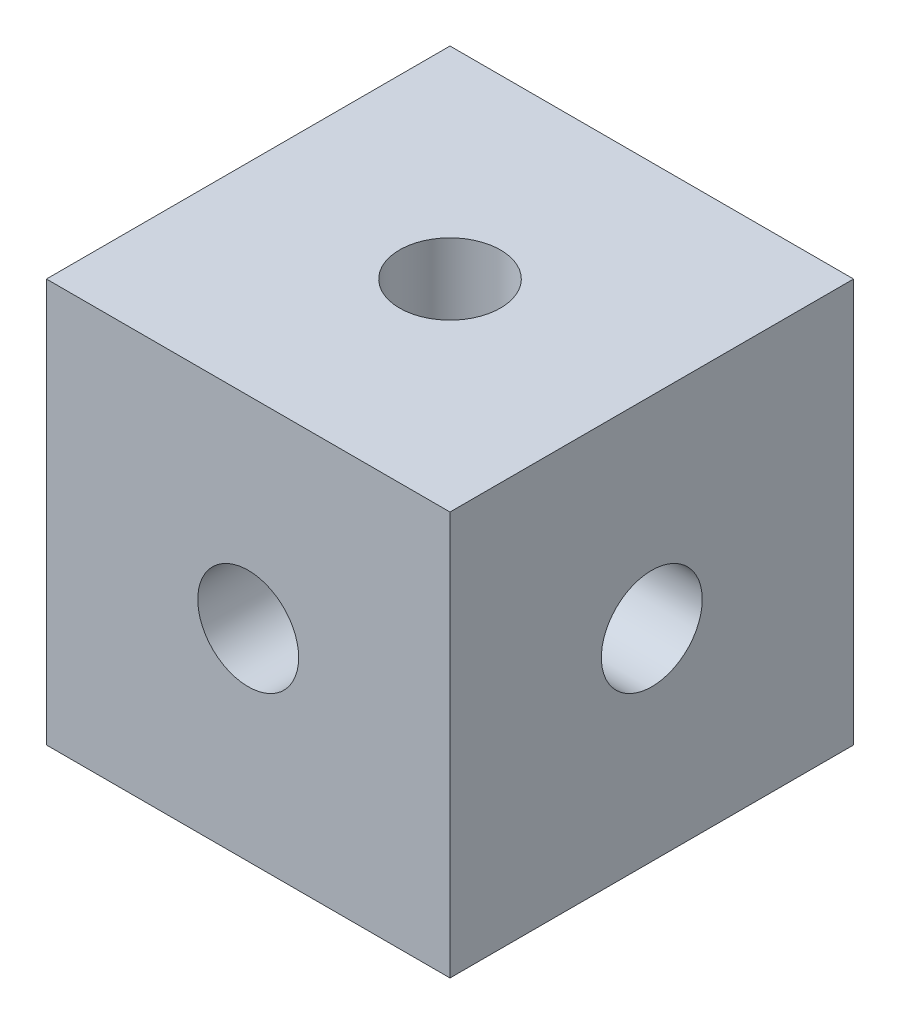
ISO-10303-21;
HEADER;
FILE_DESCRIPTION(('STEP AP214'),'2;1');
FILE_NAME('part.step','',(''),(''),'','','');
FILE_SCHEMA(('AUTOMOTIVE_DESIGN { 1 0 10303 214 1 1 1 1 }'));
ENDSEC;
DATA;
#1=APPLICATION_CONTEXT('core data for automotive mechanical design processes');
#2=APPLICATION_PROTOCOL_DEFINITION('international standard','automotive_design',2000,#1);
#3=PRODUCT_CONTEXT('',#1,'mechanical');
#4=PRODUCT('Part','Part','',(#3));
#5=PRODUCT_RELATED_PRODUCT_CATEGORY('part','',(#4));
#6=PRODUCT_DEFINITION_FORMATION('','',#4);
#7=PRODUCT_DEFINITION_CONTEXT('part definition',#1,'design');
#8=PRODUCT_DEFINITION('design','',#6,#7);
#9=PRODUCT_DEFINITION_SHAPE('','',#8);
#10=(LENGTH_UNIT() NAMED_UNIT(*) SI_UNIT(.MILLI.,.METRE.));
#11=(NAMED_UNIT(*) PLANE_ANGLE_UNIT() SI_UNIT($,.RADIAN.));
#12=(NAMED_UNIT(*) SI_UNIT($,.STERADIAN.) SOLID_ANGLE_UNIT());
#13=UNCERTAINTY_MEASURE_WITH_UNIT(LENGTH_MEASURE(1.E-05),#10,'distance_accuracy_value','');
#14=(GEOMETRIC_REPRESENTATION_CONTEXT(3) GLOBAL_UNCERTAINTY_ASSIGNED_CONTEXT((#13)) GLOBAL_UNIT_ASSIGNED_CONTEXT((#10,
#11,#12)) REPRESENTATION_CONTEXT('',''));
#15=CARTESIAN_POINT('',(0.,0.,0.));
#16=DIRECTION('',(0.,0.,1.));
#17=DIRECTION('',(1.,0.,0.));
#18=AXIS2_PLACEMENT_3D('',#15,#16,#17);
#19=CARTESIAN_POINT('',(0.,0.,5.));
#20=DIRECTION('',(0.,0.,1.));
#21=DIRECTION('',(1.,0.,0.));
#22=AXIS2_PLACEMENT_3D('',#19,#20,#21);
#23=CYLINDRICAL_SURFACE('',#22,1.24999999999999);
#24=CARTESIAN_POINT('',(0.,0.,5.));
#25=DIRECTION('',(0.,0.,1.));
#26=DIRECTION('',(1.,0.,0.));
#27=AXIS2_PLACEMENT_3D('',#24,#25,#26);
#28=CIRCLE('',#27,1.24999999999999);
#29=CARTESIAN_POINT('',(1.24999999999999,0.,5.));
#30=VERTEX_POINT('',#29);
#31=EDGE_CURVE('E147',#30,#30,#28,.T.);
#32=ORIENTED_EDGE('',*,*,#31,.T.);
#33=EDGE_LOOP('',(#32));
#34=FACE_BOUND('',#33,.T.);
#35=CARTESIAN_POINT('',(0.,0.,0.));
#36=DIRECTION('',(-0.707106781186547,0.,0.707106781186547));
#37=DIRECTION('',(0.707106781186547,0.,0.707106781186547));
#38=AXIS2_PLACEMENT_3D('',#35,#36,#37);
#39=ELLIPSE('',#38,1.76776695296636,1.24999999999999);
#40=CARTESIAN_POINT('',(0.883883476483179,0.883883476483179,0.883883476483179));
#41=VERTEX_POINT('',#40);
#42=CARTESIAN_POINT('',(0.883883476483179,-0.883883476483179,0.883883476483179));
#43=VERTEX_POINT('',#42);
#44=EDGE_CURVE('E111',#41,#43,#39,.F.);
#45=ORIENTED_EDGE('',*,*,#44,.T.);
#46=CARTESIAN_POINT('',(0.,0.,0.));
#47=DIRECTION('',(0.,0.707106781186547,0.707106781186547));
#48=DIRECTION('',(0.,-0.707106781186547,0.707106781186547));
#49=AXIS2_PLACEMENT_3D('',#46,#47,#48);
#50=ELLIPSE('',#49,1.76776695296636,1.24999999999999);
#51=CARTESIAN_POINT('',(-0.883883476483179,-0.883883476483179,0.883883476483179));
#52=VERTEX_POINT('',#51);
#53=EDGE_CURVE('E61',#43,#52,#50,.F.);
#54=ORIENTED_EDGE('',*,*,#53,.T.);
#55=CARTESIAN_POINT('',(0.,0.,0.));
#56=DIRECTION('',(0.707106781186547,0.,0.707106781186547));
#57=DIRECTION('',(-0.707106781186547,0.,0.707106781186547));
#58=AXIS2_PLACEMENT_3D('',#55,#56,#57);
#59=ELLIPSE('',#58,1.76776695296636,1.24999999999999);
#60=CARTESIAN_POINT('',(-0.883883476483179,0.883883476483179,0.883883476483179));
#61=VERTEX_POINT('',#60);
#62=EDGE_CURVE('E107',#52,#61,#59,.F.);
#63=ORIENTED_EDGE('',*,*,#62,.T.);
#64=CARTESIAN_POINT('',(0.,0.,0.));
#65=DIRECTION('',(0.,-0.707106781186547,0.707106781186547));
#66=DIRECTION('',(0.,0.707106781186547,0.707106781186547));
#67=AXIS2_PLACEMENT_3D('',#64,#65,#66);
#68=ELLIPSE('',#67,1.76776695296636,1.24999999999999);
#69=EDGE_CURVE('E101',#61,#41,#68,.F.);
#70=ORIENTED_EDGE('',*,*,#69,.T.);
#71=EDGE_LOOP('',(#45,#54,#63,#70));
#72=FACE_BOUND('',#71,.T.);
#73=ADVANCED_FACE('F38',(#34,#72),#23,.F.);
#74=CARTESIAN_POINT('',(5.,5.,5.));
#75=DIRECTION('',(-1.,0.,0.));
#76=DIRECTION('',(0.,0.,1.));
#77=AXIS2_PLACEMENT_3D('',#74,#75,#76);
#78=PLANE('',#77);
#79=CARTESIAN_POINT('',(5.,0.,0.));
#80=DIRECTION('',(1.,0.,0.));
#81=DIRECTION('',(0.,0.,-1.));
#82=AXIS2_PLACEMENT_3D('',#79,#80,#81);
#83=CIRCLE('',#82,1.24999999999999);
#84=CARTESIAN_POINT('',(5.,0.,-1.24999999999999));
#85=VERTEX_POINT('',#84);
#86=EDGE_CURVE('E141',#85,#85,#83,.T.);
#87=ORIENTED_EDGE('',*,*,#86,.F.);
#88=EDGE_LOOP('',(#87));
#89=FACE_BOUND('',#88,.T.);
#90=DIRECTION('',(0.,0.,-1.));
#91=VECTOR('',#90,1.);
#92=CARTESIAN_POINT('',(5.,-5.,5.));
#93=LINE('',#92,#91);
#94=CARTESIAN_POINT('',(5.,-5.,5.));
#95=VERTEX_POINT('',#94);
#96=CARTESIAN_POINT('',(5.,-5.,-5.));
#97=VERTEX_POINT('',#96);
#98=EDGE_CURVE('E153',#95,#97,#93,.T.);
#99=ORIENTED_EDGE('',*,*,#98,.T.);
#100=DIRECTION('',(0.,-1.,0.));
#101=VECTOR('',#100,1.);
#102=CARTESIAN_POINT('',(5.,5.,-5.));
#103=LINE('',#102,#101);
#104=CARTESIAN_POINT('',(5.,5.,-5.));
#105=VERTEX_POINT('',#104);
#106=EDGE_CURVE('E117',#105,#97,#103,.T.);
#107=ORIENTED_EDGE('',*,*,#106,.F.);
#108=DIRECTION('',(0.,0.,-1.));
#109=VECTOR('',#108,1.);
#110=CARTESIAN_POINT('',(5.,5.,5.));
#111=LINE('',#110,#109);
#112=CARTESIAN_POINT('',(5.,5.,5.));
#113=VERTEX_POINT('',#112);
#114=EDGE_CURVE('E154',#113,#105,#111,.T.);
#115=ORIENTED_EDGE('',*,*,#114,.F.);
#116=DIRECTION('',(0.,-1.,0.));
#117=VECTOR('',#116,1.);
#118=CARTESIAN_POINT('',(5.,5.,5.));
#119=LINE('',#118,#117);
#120=EDGE_CURVE('E164',#113,#95,#119,.T.);
#121=ORIENTED_EDGE('',*,*,#120,.T.);
#122=EDGE_LOOP('',(#99,#107,#115,#121));
#123=FACE_BOUND('',#122,.T.);
#124=ADVANCED_FACE('F40',(#89,#123),#78,.F.);
#125=CARTESIAN_POINT('',(-5.,5.,-5.));
#126=DIRECTION('',(0.,0.,1.));
#127=DIRECTION('',(1.,0.,0.));
#128=AXIS2_PLACEMENT_3D('',#125,#126,#127);
#129=PLANE('',#128);
#130=CARTESIAN_POINT('',(0.,0.,-5.));
#131=DIRECTION('',(0.,0.,1.));
#132=DIRECTION('',(1.,0.,0.));
#133=AXIS2_PLACEMENT_3D('',#130,#131,#132);
#134=CIRCLE('',#133,1.25);
#135=CARTESIAN_POINT('',(1.25,0.,-5.));
#136=VERTEX_POINT('',#135);
#137=EDGE_CURVE('E150',#136,#136,#134,.T.);
#138=ORIENTED_EDGE('',*,*,#137,.T.);
#139=EDGE_LOOP('',(#138));
#140=FACE_BOUND('',#139,.T.);
#141=DIRECTION('',(-1.,0.,0.));
#142=VECTOR('',#141,1.);
#143=CARTESIAN_POINT('',(-5.,-5.,-5.));
#144=LINE('',#143,#142);
#145=CARTESIAN_POINT('',(-5.,-5.,-5.));
#146=VERTEX_POINT('',#145);
#147=EDGE_CURVE('E167',#97,#146,#144,.T.);
#148=ORIENTED_EDGE('',*,*,#147,.T.);
#149=DIRECTION('',(0.,-1.,0.));
#150=VECTOR('',#149,1.);
#151=CARTESIAN_POINT('',(-5.,5.,-5.));
#152=LINE('',#151,#150);
#153=CARTESIAN_POINT('',(-5.,5.,-5.));
#154=VERTEX_POINT('',#153);
#155=EDGE_CURVE('E123',#154,#146,#152,.T.);
#156=ORIENTED_EDGE('',*,*,#155,.F.);
#157=DIRECTION('',(-1.,0.,0.));
#158=VECTOR('',#157,1.);
#159=CARTESIAN_POINT('',(-5.,5.,-5.));
#160=LINE('',#159,#158);
#161=EDGE_CURVE('E157',#105,#154,#160,.T.);
#162=ORIENTED_EDGE('',*,*,#161,.F.);
#163=ORIENTED_EDGE('',*,*,#106,.T.);
#164=EDGE_LOOP('',(#148,#156,#162,#163));
#165=FACE_BOUND('',#164,.T.);
#166=ADVANCED_FACE('F197',(#140,#165),#129,.F.);
#167=CARTESIAN_POINT('',(-5.,5.,5.));
#168=DIRECTION('',(1.,0.,0.));
#169=DIRECTION('',(0.,0.,-1.));
#170=AXIS2_PLACEMENT_3D('',#167,#168,#169);
#171=PLANE('',#170);
#172=CARTESIAN_POINT('',(-5.,0.,0.));
#173=DIRECTION('',(1.,0.,0.));
#174=DIRECTION('',(0.,0.,-1.));
#175=AXIS2_PLACEMENT_3D('',#172,#173,#174);
#176=CIRCLE('',#175,1.25);
#177=CARTESIAN_POINT('',(-5.,0.,-1.25));
#178=VERTEX_POINT('',#177);
#179=EDGE_CURVE('E144',#178,#178,#176,.T.);
#180=ORIENTED_EDGE('',*,*,#179,.T.);
#181=EDGE_LOOP('',(#180));
#182=FACE_BOUND('',#181,.T.);
#183=DIRECTION('',(0.,0.,1.));
#184=VECTOR('',#183,1.);
#185=CARTESIAN_POINT('',(-5.,-5.,5.));
#186=LINE('',#185,#184);
#187=CARTESIAN_POINT('',(-5.,-5.,5.));
#188=VERTEX_POINT('',#187);
#189=EDGE_CURVE('E169',#146,#188,#186,.T.);
#190=ORIENTED_EDGE('',*,*,#189,.T.);
#191=DIRECTION('',(0.,-1.,0.));
#192=VECTOR('',#191,1.);
#193=CARTESIAN_POINT('',(-5.,5.,5.));
#194=LINE('',#193,#192);
#195=CARTESIAN_POINT('',(-5.,5.,5.));
#196=VERTEX_POINT('',#195);
#197=EDGE_CURVE('E174',#196,#188,#194,.T.);
#198=ORIENTED_EDGE('',*,*,#197,.F.);
#199=DIRECTION('',(0.,0.,1.));
#200=VECTOR('',#199,1.);
#201=CARTESIAN_POINT('',(-5.,5.,5.));
#202=LINE('',#201,#200);
#203=EDGE_CURVE('E160',#154,#196,#202,.T.);
#204=ORIENTED_EDGE('',*,*,#203,.F.);
#205=ORIENTED_EDGE('',*,*,#155,.T.);
#206=EDGE_LOOP('',(#190,#198,#204,#205));
#207=FACE_BOUND('',#206,.T.);
#208=ADVANCED_FACE('F181',(#182,#207),#171,.F.);
#209=CARTESIAN_POINT('',(-5.,5.,5.));
#210=DIRECTION('',(0.,0.,-1.));
#211=DIRECTION('',(-1.,0.,0.));
#212=AXIS2_PLACEMENT_3D('',#209,#210,#211);
#213=PLANE('',#212);
#214=ORIENTED_EDGE('',*,*,#31,.F.);
#215=EDGE_LOOP('',(#214));
#216=FACE_BOUND('',#215,.T.);
#217=DIRECTION('',(1.,0.,0.));
#218=VECTOR('',#217,1.);
#219=CARTESIAN_POINT('',(-5.,-5.,5.));
#220=LINE('',#219,#218);
#221=EDGE_CURVE('E158',#188,#95,#220,.T.);
#222=ORIENTED_EDGE('',*,*,#221,.T.);
#223=ORIENTED_EDGE('',*,*,#120,.F.);
#224=DIRECTION('',(1.,0.,0.));
#225=VECTOR('',#224,1.);
#226=CARTESIAN_POINT('',(-5.,5.,5.));
#227=LINE('',#226,#225);
#228=EDGE_CURVE('E162',#196,#113,#227,.T.);
#229=ORIENTED_EDGE('',*,*,#228,.F.);
#230=ORIENTED_EDGE('',*,*,#197,.T.);
#231=EDGE_LOOP('',(#222,#223,#229,#230));
#232=FACE_BOUND('',#231,.T.);
#233=ADVANCED_FACE('F190',(#216,#232),#213,.F.);
#234=CARTESIAN_POINT('',(0.,5.,0.));
#235=DIRECTION('',(0.,-1.,0.));
#236=DIRECTION('',(0.,0.,-1.));
#237=AXIS2_PLACEMENT_3D('',#234,#235,#236);
#238=PLANE('',#237);
#239=CARTESIAN_POINT('',(0.,5.,0.));
#240=DIRECTION('',(0.,1.,0.));
#241=DIRECTION('',(0.,0.,1.));
#242=AXIS2_PLACEMENT_3D('',#239,#240,#241);
#243=CIRCLE('',#242,1.24999999999999);
#244=CARTESIAN_POINT('',(0.,5.,1.24999999999999));
#245=VERTEX_POINT('',#244);
#246=EDGE_CURVE('E324',#245,#245,#243,.T.);
#247=ORIENTED_EDGE('',*,*,#246,.F.);
#248=EDGE_LOOP('',(#247));
#249=FACE_BOUND('',#248,.T.);
#250=ORIENTED_EDGE('',*,*,#114,.T.);
#251=ORIENTED_EDGE('',*,*,#161,.T.);
#252=ORIENTED_EDGE('',*,*,#203,.T.);
#253=ORIENTED_EDGE('',*,*,#228,.T.);
#254=EDGE_LOOP('',(#250,#251,#252,#253));
#255=FACE_BOUND('',#254,.T.);
#256=ADVANCED_FACE('F196',(#249,#255),#238,.F.);
#257=CARTESIAN_POINT('',(0.,-5.,0.));
#258=DIRECTION('',(0.,-1.,0.));
#259=DIRECTION('',(0.,0.,-1.));
#260=AXIS2_PLACEMENT_3D('',#257,#258,#259);
#261=PLANE('',#260);
#262=CARTESIAN_POINT('',(0.,-5.,0.));
#263=DIRECTION('',(0.,1.,0.));
#264=DIRECTION('',(0.,0.,1.));
#265=AXIS2_PLACEMENT_3D('',#262,#263,#264);
#266=CIRCLE('',#265,1.25);
#267=CARTESIAN_POINT('',(0.,-5.,1.25));
#268=VERTEX_POINT('',#267);
#269=EDGE_CURVE('E323',#268,#268,#266,.T.);
#270=ORIENTED_EDGE('',*,*,#269,.T.);
#271=EDGE_LOOP('',(#270));
#272=FACE_BOUND('',#271,.T.);
#273=ORIENTED_EDGE('',*,*,#98,.F.);
#274=ORIENTED_EDGE('',*,*,#221,.F.);
#275=ORIENTED_EDGE('',*,*,#189,.F.);
#276=ORIENTED_EDGE('',*,*,#147,.F.);
#277=EDGE_LOOP('',(#273,#274,#275,#276));
#278=FACE_BOUND('',#277,.T.);
#279=ADVANCED_FACE('F187',(#272,#278),#261,.T.);
#280=CARTESIAN_POINT('',(0.,0.,0.));
#281=DIRECTION('',(0.707106781186547,0.,0.707106781186547));
#282=DIRECTION('',(-0.707106781186547,0.,0.707106781186547));
#283=AXIS2_PLACEMENT_3D('',#280,#281,#282);
#284=ELLIPSE('',#283,1.76776695296636,1.24999999999999);
#285=CARTESIAN_POINT('',(0.883883476483179,-0.883883476483179,-0.883883476483179));
#286=VERTEX_POINT('',#285);
#287=CARTESIAN_POINT('',(0.883883476483179,0.883883476483179,-0.883883476483179));
#288=VERTEX_POINT('',#287);
#289=EDGE_CURVE('E120',#286,#288,#284,.T.);
#290=ORIENTED_EDGE('',*,*,#289,.T.);
#291=CARTESIAN_POINT('',(0.,0.,0.));
#292=DIRECTION('',(0.,0.707106781186547,0.707106781186547));
#293=DIRECTION('',(0.,-0.707106781186547,0.707106781186547));
#294=AXIS2_PLACEMENT_3D('',#291,#292,#293);
#295=ELLIPSE('',#294,1.76776695296636,1.24999999999999);
#296=CARTESIAN_POINT('',(-0.883883476483179,0.883883476483179,-0.883883476483179));
#297=VERTEX_POINT('',#296);
#298=EDGE_CURVE('E53',#288,#297,#295,.T.);
#299=ORIENTED_EDGE('',*,*,#298,.T.);
#300=CARTESIAN_POINT('',(0.,0.,0.));
#301=DIRECTION('',(-0.707106781186547,0.,0.707106781186547));
#302=DIRECTION('',(0.707106781186547,0.,0.707106781186547));
#303=AXIS2_PLACEMENT_3D('',#300,#301,#302);
#304=ELLIPSE('',#303,1.76776695296636,1.24999999999999);
#305=CARTESIAN_POINT('',(-0.883883476483179,-0.883883476483179,-0.883883476483179));
#306=VERTEX_POINT('',#305);
#307=EDGE_CURVE('E116',#297,#306,#304,.T.);
#308=ORIENTED_EDGE('',*,*,#307,.T.);
#309=CARTESIAN_POINT('',(0.,0.,0.));
#310=DIRECTION('',(0.,-0.707106781186547,0.707106781186547));
#311=DIRECTION('',(0.,0.707106781186547,0.707106781186547));
#312=AXIS2_PLACEMENT_3D('',#309,#310,#311);
#313=ELLIPSE('',#312,1.76776695296636,1.24999999999999);
#314=EDGE_CURVE('E133',#306,#286,#313,.T.);
#315=ORIENTED_EDGE('',*,*,#314,.T.);
#316=EDGE_LOOP('',(#290,#299,#308,#315));
#317=FACE_BOUND('',#316,.T.);
#318=ORIENTED_EDGE('',*,*,#137,.F.);
#319=EDGE_LOOP('',(#318));
#320=FACE_BOUND('',#319,.T.);
#321=ADVANCED_FACE('F130',(#317,#320),#23,.F.);
#322=CARTESIAN_POINT('',(5.,0.,0.));
#323=DIRECTION('',(1.,0.,0.));
#324=DIRECTION('',(0.,0.,-1.));
#325=AXIS2_PLACEMENT_3D('',#322,#323,#324);
#326=CYLINDRICAL_SURFACE('',#325,1.24999999999999);
#327=ORIENTED_EDGE('',*,*,#86,.T.);
#328=EDGE_LOOP('',(#327));
#329=FACE_BOUND('',#328,.T.);
#330=ORIENTED_EDGE('',*,*,#289,.F.);
#331=CARTESIAN_POINT('',(0.,0.,0.));
#332=DIRECTION('',(0.707106781186547,0.707106781186547,0.));
#333=DIRECTION('',(0.707106781186547,-0.707106781186547,0.));
#334=AXIS2_PLACEMENT_3D('',#331,#332,#333);
#335=ELLIPSE('',#334,1.76776695296636,1.24999999999999);
#336=EDGE_CURVE('E11',#286,#43,#335,.F.);
#337=ORIENTED_EDGE('',*,*,#336,.T.);
#338=ORIENTED_EDGE('',*,*,#44,.F.);
#339=CARTESIAN_POINT('',(0.,0.,0.));
#340=DIRECTION('',(0.707106781186547,-0.707106781186547,0.));
#341=DIRECTION('',(0.707106781186547,0.707106781186547,0.));
#342=AXIS2_PLACEMENT_3D('',#339,#340,#341);
#343=ELLIPSE('',#342,1.76776695296636,1.24999999999999);
#344=EDGE_CURVE('E46',#41,#288,#343,.F.);
#345=ORIENTED_EDGE('',*,*,#344,.T.);
#346=EDGE_LOOP('',(#330,#337,#338,#345));
#347=FACE_BOUND('',#346,.T.);
#348=ADVANCED_FACE('F115',(#329,#347),#326,.F.);
#349=ORIENTED_EDGE('',*,*,#179,.F.);
#350=EDGE_LOOP('',(#349));
#351=FACE_BOUND('',#350,.T.);
#352=ORIENTED_EDGE('',*,*,#307,.F.);
#353=CARTESIAN_POINT('',(0.,0.,0.));
#354=DIRECTION('',(0.707106781186547,0.707106781186547,0.));
#355=DIRECTION('',(0.707106781186547,-0.707106781186547,0.));
#356=AXIS2_PLACEMENT_3D('',#353,#354,#355);
#357=ELLIPSE('',#356,1.76776695296636,1.24999999999999);
#358=EDGE_CURVE('E113',#297,#61,#357,.T.);
#359=ORIENTED_EDGE('',*,*,#358,.T.);
#360=ORIENTED_EDGE('',*,*,#62,.F.);
#361=CARTESIAN_POINT('',(0.,0.,0.));
#362=DIRECTION('',(0.707106781186547,-0.707106781186547,0.));
#363=DIRECTION('',(0.707106781186547,0.707106781186547,0.));
#364=AXIS2_PLACEMENT_3D('',#361,#362,#363);
#365=ELLIPSE('',#364,1.76776695296636,1.24999999999999);
#366=EDGE_CURVE('E135',#52,#306,#365,.T.);
#367=ORIENTED_EDGE('',*,*,#366,.T.);
#368=EDGE_LOOP('',(#352,#359,#360,#367));
#369=FACE_BOUND('',#368,.T.);
#370=ADVANCED_FACE('F219',(#351,#369),#326,.F.);
#371=CARTESIAN_POINT('',(0.,5.,0.));
#372=DIRECTION('',(0.,1.,0.));
#373=DIRECTION('',(0.,0.,1.));
#374=AXIS2_PLACEMENT_3D('',#371,#372,#373);
#375=CYLINDRICAL_SURFACE('',#374,1.24999999999999);
#376=ORIENTED_EDGE('',*,*,#246,.T.);
#377=EDGE_LOOP('',(#376));
#378=FACE_BOUND('',#377,.T.);
#379=ORIENTED_EDGE('',*,*,#298,.F.);
#380=ORIENTED_EDGE('',*,*,#344,.F.);
#381=ORIENTED_EDGE('',*,*,#69,.F.);
#382=ORIENTED_EDGE('',*,*,#358,.F.);
#383=EDGE_LOOP('',(#379,#380,#381,#382));
#384=FACE_BOUND('',#383,.T.);
#385=ADVANCED_FACE('F100',(#378,#384),#375,.F.);
#386=ORIENTED_EDGE('',*,*,#269,.F.);
#387=EDGE_LOOP('',(#386));
#388=FACE_BOUND('',#387,.T.);
#389=ORIENTED_EDGE('',*,*,#336,.F.);
#390=ORIENTED_EDGE('',*,*,#314,.F.);
#391=ORIENTED_EDGE('',*,*,#366,.F.);
#392=ORIENTED_EDGE('',*,*,#53,.F.);
#393=EDGE_LOOP('',(#389,#390,#391,#392));
#394=FACE_BOUND('',#393,.T.);
#395=ADVANCED_FACE('F252',(#388,#394),#375,.F.);
#396=CLOSED_SHELL('',(#73,#124,#166,#208,#233,#256,#279,#321,#348,#370,#385,#395));
#397=MANIFOLD_SOLID_BREP('B2',#396);
#398=ADVANCED_BREP_SHAPE_REPRESENTATION('',(#18,#397),#14);
#399=SHAPE_DEFINITION_REPRESENTATION(#9,#398);
ENDSEC;
END-ISO-10303-21;
